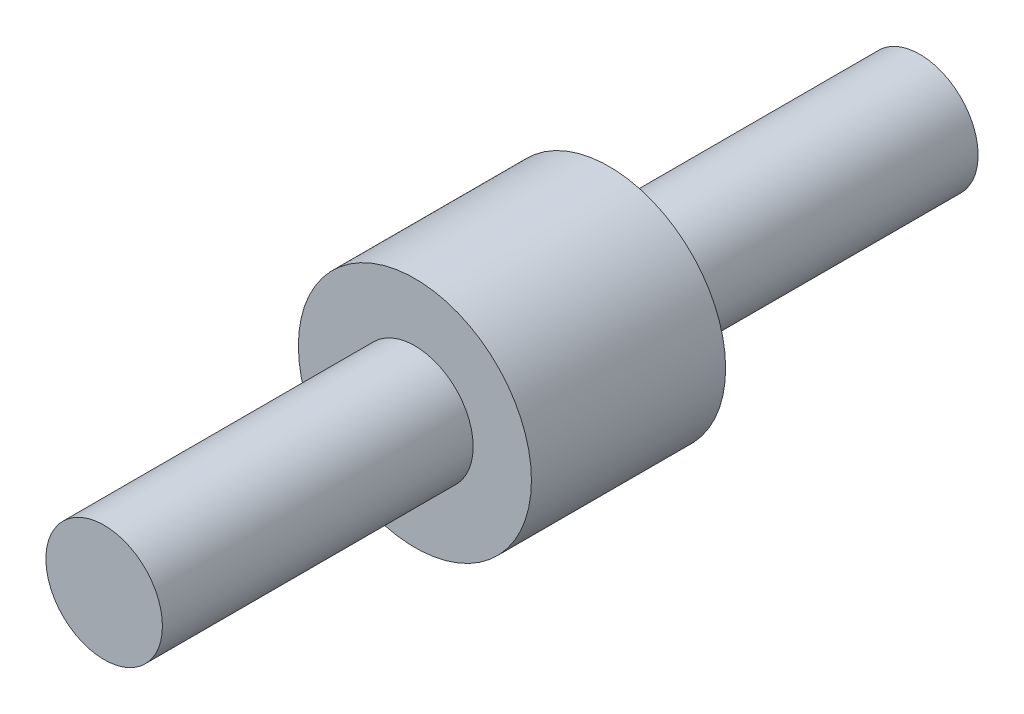
ISO-10303-21;
HEADER;
FILE_DESCRIPTION(('STEP AP214'),'2;1');
FILE_NAME('part.step','',(''),(''),'','','');
FILE_SCHEMA(('AUTOMOTIVE_DESIGN { 1 0 10303 214 1 1 1 1 }'));
ENDSEC;
DATA;
#1=APPLICATION_CONTEXT('core data for automotive mechanical design processes');
#2=APPLICATION_PROTOCOL_DEFINITION('international standard','automotive_design',2000,#1);
#3=PRODUCT_CONTEXT('',#1,'mechanical');
#4=PRODUCT('Part','Part','',(#3));
#5=PRODUCT_RELATED_PRODUCT_CATEGORY('part','',(#4));
#6=PRODUCT_DEFINITION_FORMATION('','',#4);
#7=PRODUCT_DEFINITION_CONTEXT('part definition',#1,'design');
#8=PRODUCT_DEFINITION('design','',#6,#7);
#9=PRODUCT_DEFINITION_SHAPE('','',#8);
#10=(LENGTH_UNIT() NAMED_UNIT(*) SI_UNIT(.MILLI.,.METRE.));
#11=(NAMED_UNIT(*) PLANE_ANGLE_UNIT() SI_UNIT($,.RADIAN.));
#12=(NAMED_UNIT(*) SI_UNIT($,.STERADIAN.) SOLID_ANGLE_UNIT());
#13=UNCERTAINTY_MEASURE_WITH_UNIT(LENGTH_MEASURE(1.E-05),#10,'distance_accuracy_value','');
#14=(GEOMETRIC_REPRESENTATION_CONTEXT(3) GLOBAL_UNCERTAINTY_ASSIGNED_CONTEXT((#13)) GLOBAL_UNIT_ASSIGNED_CONTEXT((#10,
#11,#12)) REPRESENTATION_CONTEXT('',''));
#15=CARTESIAN_POINT('',(0.,0.,0.));
#16=DIRECTION('',(0.,0.,1.));
#17=DIRECTION('',(1.,0.,0.));
#18=AXIS2_PLACEMENT_3D('',#15,#16,#17);
#19=CARTESIAN_POINT('',(0.,0.,5.));
#20=DIRECTION('',(0.,0.,-1.));
#21=DIRECTION('',(-1.,0.,0.));
#22=AXIS2_PLACEMENT_3D('',#19,#20,#21);
#23=CYLINDRICAL_SURFACE('',#22,3.);
#24=CARTESIAN_POINT('',(0.,0.,5.));
#25=DIRECTION('',(0.,0.,1.));
#26=DIRECTION('',(1.,0.,0.));
#27=AXIS2_PLACEMENT_3D('',#24,#25,#26);
#28=CIRCLE('',#27,3.);
#29=CARTESIAN_POINT('',(3.,0.,5.));
#30=VERTEX_POINT('',#29);
#31=EDGE_CURVE('E44',#30,#30,#28,.T.);
#32=ORIENTED_EDGE('',*,*,#31,.F.);
#33=EDGE_LOOP('',(#32));
#34=FACE_BOUND('',#33,.T.);
#35=CARTESIAN_POINT('',(0.,0.,0.));
#36=DIRECTION('',(0.,0.,1.));
#37=DIRECTION('',(1.,0.,0.));
#38=AXIS2_PLACEMENT_3D('',#35,#36,#37);
#39=CIRCLE('',#38,3.);
#40=CARTESIAN_POINT('',(3.,0.,0.));
#41=VERTEX_POINT('',#40);
#42=EDGE_CURVE('E49',#41,#41,#39,.T.);
#43=ORIENTED_EDGE('',*,*,#42,.T.);
#44=EDGE_LOOP('',(#43));
#45=FACE_BOUND('',#44,.T.);
#46=ADVANCED_FACE('F37',(#34,#45),#23,.T.);
#47=CARTESIAN_POINT('',(0.,0.,5.));
#48=DIRECTION('',(0.,0.,1.));
#49=DIRECTION('',(1.,0.,0.));
#50=AXIS2_PLACEMENT_3D('',#47,#48,#49);
#51=PLANE('',#50);
#52=CARTESIAN_POINT('',(0.,0.,5.));
#53=DIRECTION('',(0.,0.,1.));
#54=DIRECTION('',(1.,0.,0.));
#55=AXIS2_PLACEMENT_3D('',#52,#53,#54);
#56=CIRCLE('',#55,1.5);
#57=CARTESIAN_POINT('',(1.5,0.,5.));
#58=VERTEX_POINT('',#57);
#59=EDGE_CURVE('E11',#58,#58,#56,.T.);
#60=ORIENTED_EDGE('',*,*,#59,.F.);
#61=EDGE_LOOP('',(#60));
#62=FACE_BOUND('',#61,.T.);
#63=ORIENTED_EDGE('',*,*,#31,.T.);
#64=EDGE_LOOP('',(#63));
#65=FACE_BOUND('',#64,.T.);
#66=ADVANCED_FACE('F85',(#62,#65),#51,.T.);
#67=CARTESIAN_POINT('',(0.,0.,0.));
#68=DIRECTION('',(0.,0.,1.));
#69=DIRECTION('',(1.,0.,0.));
#70=AXIS2_PLACEMENT_3D('',#67,#68,#69);
#71=PLANE('',#70);
#72=CARTESIAN_POINT('',(0.,0.,0.));
#73=DIRECTION('',(0.,0.,1.));
#74=DIRECTION('',(1.,0.,0.));
#75=AXIS2_PLACEMENT_3D('',#72,#73,#74);
#76=CIRCLE('',#75,1.5);
#77=CARTESIAN_POINT('',(1.5,0.,0.));
#78=VERTEX_POINT('',#77);
#79=EDGE_CURVE('E40',#78,#78,#76,.T.);
#80=ORIENTED_EDGE('',*,*,#79,.T.);
#81=EDGE_LOOP('',(#80));
#82=FACE_BOUND('',#81,.T.);
#83=ORIENTED_EDGE('',*,*,#42,.F.);
#84=EDGE_LOOP('',(#83));
#85=FACE_BOUND('',#84,.T.);
#86=ADVANCED_FACE('F81',(#82,#85),#71,.F.);
#87=CARTESIAN_POINT('',(0.,0.,-8.));
#88=DIRECTION('',(0.,0.,-1.));
#89=DIRECTION('',(-1.,0.,0.));
#90=AXIS2_PLACEMENT_3D('',#87,#88,#89);
#91=PLANE('',#90);
#92=CARTESIAN_POINT('',(0.,0.,-8.));
#93=DIRECTION('',(0.,0.,-1.));
#94=DIRECTION('',(-1.,0.,0.));
#95=AXIS2_PLACEMENT_3D('',#92,#93,#94);
#96=CIRCLE('',#95,1.5);
#97=CARTESIAN_POINT('',(-1.5,0.,-8.));
#98=VERTEX_POINT('',#97);
#99=EDGE_CURVE('E61',#98,#98,#96,.T.);
#100=ORIENTED_EDGE('',*,*,#99,.T.);
#101=EDGE_LOOP('',(#100));
#102=FACE_BOUND('',#101,.T.);
#103=ADVANCED_FACE('F67',(#102),#91,.T.);
#104=CARTESIAN_POINT('',(0.,0.,25.2426406871193));
#105=DIRECTION('',(0.,0.,-1.));
#106=DIRECTION('',(-1.,0.,0.));
#107=AXIS2_PLACEMENT_3D('',#104,#105,#106);
#108=CYLINDRICAL_SURFACE('',#107,1.5);
#109=ORIENTED_EDGE('',*,*,#99,.F.);
#110=EDGE_LOOP('',(#109));
#111=FACE_BOUND('',#110,.T.);
#112=ORIENTED_EDGE('',*,*,#79,.F.);
#113=EDGE_LOOP('',(#112));
#114=FACE_BOUND('',#113,.T.);
#115=ADVANCED_FACE('F69',(#111,#114),#108,.T.);
#116=CARTESIAN_POINT('',(0.,0.,13.));
#117=DIRECTION('',(0.,0.,1.));
#118=DIRECTION('',(1.,0.,0.));
#119=AXIS2_PLACEMENT_3D('',#116,#117,#118);
#120=PLANE('',#119);
#121=CARTESIAN_POINT('',(0.,0.,13.));
#122=DIRECTION('',(0.,0.,1.));
#123=DIRECTION('',(1.,0.,0.));
#124=AXIS2_PLACEMENT_3D('',#121,#122,#123);
#125=CIRCLE('',#124,1.5);
#126=CARTESIAN_POINT('',(1.5,0.,13.));
#127=VERTEX_POINT('',#126);
#128=EDGE_CURVE('E52',#127,#127,#125,.F.);
#129=ORIENTED_EDGE('',*,*,#128,.F.);
#130=EDGE_LOOP('',(#129));
#131=FACE_BOUND('',#130,.T.);
#132=ADVANCED_FACE('F72',(#131),#120,.T.);
#133=ORIENTED_EDGE('',*,*,#59,.T.);
#134=EDGE_LOOP('',(#133));
#135=FACE_BOUND('',#134,.T.);
#136=ORIENTED_EDGE('',*,*,#128,.T.);
#137=EDGE_LOOP('',(#136));
#138=FACE_BOUND('',#137,.T.);
#139=ADVANCED_FACE('F74',(#135,#138),#108,.T.);
#140=CLOSED_SHELL('',(#46,#66,#86,#103,#115,#132,#139));
#141=MANIFOLD_SOLID_BREP('B2',#140);
#142=ADVANCED_BREP_SHAPE_REPRESENTATION('',(#18,#141),#14);
#143=SHAPE_DEFINITION_REPRESENTATION(#9,#142);
ENDSEC;
END-ISO-10303-21;
